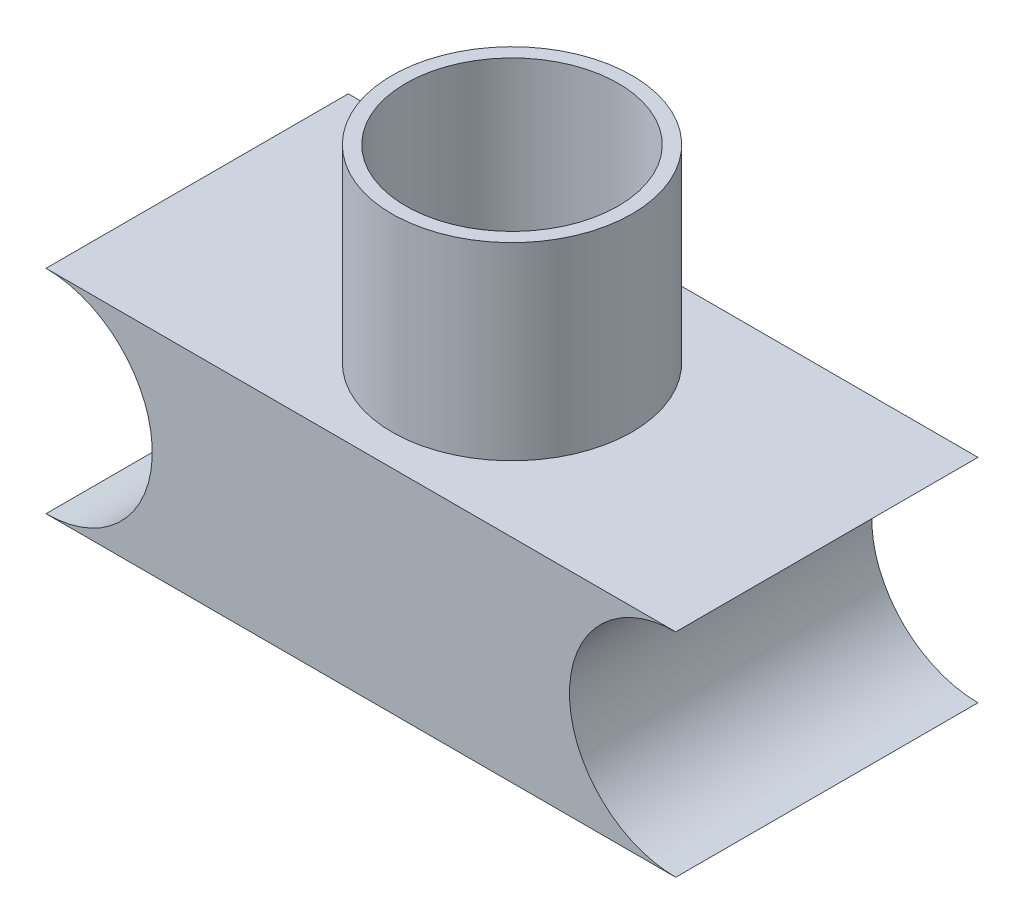
ISO-10303-21;
HEADER;
FILE_DESCRIPTION(('STEP AP214'),'2;1');
FILE_NAME('part.step','',(''),(''),'','','');
FILE_SCHEMA(('AUTOMOTIVE_DESIGN { 1 0 10303 214 1 1 1 1 }'));
ENDSEC;
DATA;
#1=APPLICATION_CONTEXT('core data for automotive mechanical design processes');
#2=APPLICATION_PROTOCOL_DEFINITION('international standard','automotive_design',2000,#1);
#3=PRODUCT_CONTEXT('',#1,'mechanical');
#4=PRODUCT('Part','Part','',(#3));
#5=PRODUCT_RELATED_PRODUCT_CATEGORY('part','',(#4));
#6=PRODUCT_DEFINITION_FORMATION('','',#4);
#7=PRODUCT_DEFINITION_CONTEXT('part definition',#1,'design');
#8=PRODUCT_DEFINITION('design','',#6,#7);
#9=PRODUCT_DEFINITION_SHAPE('','',#8);
#10=(LENGTH_UNIT() NAMED_UNIT(*) SI_UNIT(.MILLI.,.METRE.));
#11=(NAMED_UNIT(*) PLANE_ANGLE_UNIT() SI_UNIT($,.RADIAN.));
#12=(NAMED_UNIT(*) SI_UNIT($,.STERADIAN.) SOLID_ANGLE_UNIT());
#13=UNCERTAINTY_MEASURE_WITH_UNIT(LENGTH_MEASURE(1.E-05),#10,'distance_accuracy_value','');
#14=(GEOMETRIC_REPRESENTATION_CONTEXT(3) GLOBAL_UNCERTAINTY_ASSIGNED_CONTEXT((#13)) GLOBAL_UNIT_ASSIGNED_CONTEXT((#10,
#11,#12)) REPRESENTATION_CONTEXT('',''));
#15=CARTESIAN_POINT('',(0.,0.,0.));
#16=DIRECTION('',(0.,0.,1.));
#17=DIRECTION('',(1.,0.,0.));
#18=AXIS2_PLACEMENT_3D('',#15,#16,#17);
#19=CARTESIAN_POINT('',(31.75,0.,15.24));
#20=DIRECTION('',(0.,0.,-1.));
#21=DIRECTION('',(-1.,0.,0.));
#22=AXIS2_PLACEMENT_3D('',#19,#20,#21);
#23=CYLINDRICAL_SURFACE('',#22,10.715625);
#24=CARTESIAN_POINT('',(31.75,0.,-15.24));
#25=DIRECTION('',(0.,0.,-1.));
#26=DIRECTION('',(1.,0.,0.));
#27=AXIS2_PLACEMENT_3D('',#24,#25,#26);
#28=CIRCLE('',#27,10.715625);
#29=CARTESIAN_POINT('',(31.75,-10.715625,-15.24));
#30=VERTEX_POINT('',#29);
#31=CARTESIAN_POINT('',(31.75,10.715625,-15.24));
#32=VERTEX_POINT('',#31);
#33=EDGE_CURVE('E104',#30,#32,#28,.T.);
#34=ORIENTED_EDGE('',*,*,#33,.T.);
#35=DIRECTION('',(0.,0.,-1.));
#36=VECTOR('',#35,1.);
#37=CARTESIAN_POINT('',(31.75,10.715625,15.24));
#38=LINE('',#37,#36);
#39=CARTESIAN_POINT('',(31.75,10.715625,15.24));
#40=VERTEX_POINT('',#39);
#41=EDGE_CURVE('E46',#40,#32,#38,.T.);
#42=ORIENTED_EDGE('',*,*,#41,.F.);
#43=CARTESIAN_POINT('',(31.75,0.,15.24));
#44=DIRECTION('',(0.,0.,-1.));
#45=DIRECTION('',(1.,0.,0.));
#46=AXIS2_PLACEMENT_3D('',#43,#44,#45);
#47=CIRCLE('',#46,10.715625);
#48=CARTESIAN_POINT('',(31.75,-10.715625,15.24));
#49=VERTEX_POINT('',#48);
#50=EDGE_CURVE('E90',#49,#40,#47,.T.);
#51=ORIENTED_EDGE('',*,*,#50,.F.);
#52=DIRECTION('',(0.,0.,-1.));
#53=VECTOR('',#52,1.);
#54=CARTESIAN_POINT('',(31.75,-10.715625,15.24));
#55=LINE('',#54,#53);
#56=EDGE_CURVE('E100',#49,#30,#55,.T.);
#57=ORIENTED_EDGE('',*,*,#56,.T.);
#58=EDGE_LOOP('',(#34,#42,#51,#57));
#59=FACE_BOUND('',#58,.T.);
#60=ADVANCED_FACE('F38',(#59),#23,.F.);
#61=CARTESIAN_POINT('',(-31.75,10.715625,15.24));
#62=DIRECTION('',(0.,-1.,0.));
#63=DIRECTION('',(1.,0.,0.));
#64=AXIS2_PLACEMENT_3D('',#61,#62,#63);
#65=PLANE('',#64);
#66=CARTESIAN_POINT('',(0.,10.715625,0.));
#67=DIRECTION('',(0.,-1.,0.));
#68=DIRECTION('',(1.,0.,0.));
#69=AXIS2_PLACEMENT_3D('',#66,#67,#68);
#70=CIRCLE('',#69,12.099925);
#71=CARTESIAN_POINT('',(12.099925,10.715625,0.));
#72=VERTEX_POINT('',#71);
#73=EDGE_CURVE('E11',#72,#72,#70,.F.);
#74=ORIENTED_EDGE('',*,*,#73,.F.);
#75=EDGE_LOOP('',(#74));
#76=FACE_BOUND('',#75,.T.);
#77=DIRECTION('',(-1.,0.,0.));
#78=VECTOR('',#77,1.);
#79=CARTESIAN_POINT('',(-31.75,10.715625,-15.24));
#80=LINE('',#79,#78);
#81=CARTESIAN_POINT('',(-31.75,10.715625,-15.24));
#82=VERTEX_POINT('',#81);
#83=EDGE_CURVE('E95',#32,#82,#80,.T.);
#84=ORIENTED_EDGE('',*,*,#83,.T.);
#85=DIRECTION('',(0.,0.,-1.));
#86=VECTOR('',#85,1.);
#87=CARTESIAN_POINT('',(-31.75,10.715625,15.24));
#88=LINE('',#87,#86);
#89=CARTESIAN_POINT('',(-31.75,10.715625,15.24));
#90=VERTEX_POINT('',#89);
#91=EDGE_CURVE('E93',#90,#82,#88,.T.);
#92=ORIENTED_EDGE('',*,*,#91,.F.);
#93=DIRECTION('',(-1.,0.,0.));
#94=VECTOR('',#93,1.);
#95=CARTESIAN_POINT('',(-31.75,10.715625,15.24));
#96=LINE('',#95,#94);
#97=EDGE_CURVE('E85',#40,#90,#96,.T.);
#98=ORIENTED_EDGE('',*,*,#97,.F.);
#99=ORIENTED_EDGE('',*,*,#41,.T.);
#100=EDGE_LOOP('',(#84,#92,#98,#99));
#101=FACE_BOUND('',#100,.T.);
#102=ADVANCED_FACE('F94',(#76,#101),#65,.F.);
#103=CARTESIAN_POINT('',(-31.75,0.,15.24));
#104=DIRECTION('',(0.,0.,-1.));
#105=DIRECTION('',(-1.,0.,0.));
#106=AXIS2_PLACEMENT_3D('',#103,#104,#105);
#107=CYLINDRICAL_SURFACE('',#106,10.715625);
#108=CARTESIAN_POINT('',(-31.75,0.,-15.24));
#109=DIRECTION('',(0.,0.,-1.));
#110=DIRECTION('',(1.,0.,0.));
#111=AXIS2_PLACEMENT_3D('',#108,#109,#110);
#112=CIRCLE('',#111,10.715625);
#113=CARTESIAN_POINT('',(-31.75,-10.715625,-15.24));
#114=VERTEX_POINT('',#113);
#115=EDGE_CURVE('E71',#82,#114,#112,.T.);
#116=ORIENTED_EDGE('',*,*,#115,.T.);
#117=DIRECTION('',(0.,0.,-1.));
#118=VECTOR('',#117,1.);
#119=CARTESIAN_POINT('',(-31.75,-10.715625,15.24));
#120=LINE('',#119,#118);
#121=CARTESIAN_POINT('',(-31.75,-10.715625,15.24));
#122=VERTEX_POINT('',#121);
#123=EDGE_CURVE('E96',#122,#114,#120,.T.);
#124=ORIENTED_EDGE('',*,*,#123,.F.);
#125=CARTESIAN_POINT('',(-31.75,0.,15.24));
#126=DIRECTION('',(0.,0.,-1.));
#127=DIRECTION('',(1.,0.,0.));
#128=AXIS2_PLACEMENT_3D('',#125,#126,#127);
#129=CIRCLE('',#128,10.715625);
#130=EDGE_CURVE('E88',#90,#122,#129,.T.);
#131=ORIENTED_EDGE('',*,*,#130,.F.);
#132=ORIENTED_EDGE('',*,*,#91,.T.);
#133=EDGE_LOOP('',(#116,#124,#131,#132));
#134=FACE_BOUND('',#133,.T.);
#135=ADVANCED_FACE('F98',(#134),#107,.F.);
#136=CARTESIAN_POINT('',(31.75,-10.715625,15.24));
#137=DIRECTION('',(0.,1.,0.));
#138=DIRECTION('',(0.,0.,1.));
#139=AXIS2_PLACEMENT_3D('',#136,#137,#138);
#140=PLANE('',#139);
#141=DIRECTION('',(1.,0.,0.));
#142=VECTOR('',#141,1.);
#143=CARTESIAN_POINT('',(31.75,-10.715625,-15.24));
#144=LINE('',#143,#142);
#145=EDGE_CURVE('E77',#114,#30,#144,.T.);
#146=ORIENTED_EDGE('',*,*,#145,.T.);
#147=ORIENTED_EDGE('',*,*,#56,.F.);
#148=DIRECTION('',(1.,0.,0.));
#149=VECTOR('',#148,1.);
#150=CARTESIAN_POINT('',(31.75,-10.715625,15.24));
#151=LINE('',#150,#149);
#152=EDGE_CURVE('E54',#122,#49,#151,.T.);
#153=ORIENTED_EDGE('',*,*,#152,.F.);
#154=ORIENTED_EDGE('',*,*,#123,.T.);
#155=EDGE_LOOP('',(#146,#147,#153,#154));
#156=FACE_BOUND('',#155,.T.);
#157=ADVANCED_FACE('F126',(#156),#140,.F.);
#158=CARTESIAN_POINT('',(31.75,0.,15.24));
#159=DIRECTION('',(0.,0.,1.));
#160=DIRECTION('',(1.,0.,0.));
#161=AXIS2_PLACEMENT_3D('',#158,#159,#160);
#162=PLANE('',#161);
#163=ORIENTED_EDGE('',*,*,#50,.T.);
#164=ORIENTED_EDGE('',*,*,#97,.T.);
#165=ORIENTED_EDGE('',*,*,#130,.T.);
#166=ORIENTED_EDGE('',*,*,#152,.T.);
#167=EDGE_LOOP('',(#163,#164,#165,#166));
#168=FACE_BOUND('',#167,.T.);
#169=ADVANCED_FACE('F86',(#168),#162,.T.);
#170=CARTESIAN_POINT('',(31.75,0.,-15.24));
#171=DIRECTION('',(0.,0.,1.));
#172=DIRECTION('',(1.,0.,0.));
#173=AXIS2_PLACEMENT_3D('',#170,#171,#172);
#174=PLANE('',#173);
#175=ORIENTED_EDGE('',*,*,#33,.F.);
#176=ORIENTED_EDGE('',*,*,#145,.F.);
#177=ORIENTED_EDGE('',*,*,#115,.F.);
#178=ORIENTED_EDGE('',*,*,#83,.F.);
#179=EDGE_LOOP('',(#175,#176,#177,#178));
#180=FACE_BOUND('',#179,.T.);
#181=ADVANCED_FACE('F115',(#180),#174,.F.);
#182=CARTESIAN_POINT('',(0.,29.765625,0.));
#183=DIRECTION('',(0.,-1.,0.));
#184=DIRECTION('',(1.,0.,0.));
#185=AXIS2_PLACEMENT_3D('',#182,#183,#184);
#186=CYLINDRICAL_SURFACE('',#185,10.715625);
#187=CARTESIAN_POINT('',(0.,29.765625,0.));
#188=DIRECTION('',(0.,1.,0.));
#189=DIRECTION('',(-1.,0.,0.));
#190=AXIS2_PLACEMENT_3D('',#187,#188,#189);
#191=CIRCLE('',#190,10.715625);
#192=CARTESIAN_POINT('',(10.715625,29.765625,0.));
#193=VERTEX_POINT('',#192);
#194=EDGE_CURVE('E152',#193,#193,#191,.T.);
#195=CARTESIAN_POINT('',(0.,10.715625,0.));
#196=DIRECTION('',(0.,1.,0.));
#197=DIRECTION('',(-1.,0.,0.));
#198=AXIS2_PLACEMENT_3D('',#195,#196,#197);
#199=CIRCLE('',#198,10.715625);
#200=CARTESIAN_POINT('',(10.715625,10.715625,0.));
#201=VERTEX_POINT('',#200);
#202=EDGE_CURVE('E150',#201,#201,#199,.T.);
#203=CARTESIAN_POINT('',(10.715625,29.765625,0.));
#204=CARTESIAN_POINT('',(10.715625,29.5671875,0.));
#205=CARTESIAN_POINT('',(10.715625,29.36875,0.));
#206=CARTESIAN_POINT('',(10.715625,28.971875,0.));
#207=CARTESIAN_POINT('',(10.715625,28.7734375,0.));
#208=CARTESIAN_POINT('',(10.715625,28.3765625,0.));
#209=CARTESIAN_POINT('',(10.715625,28.178125,0.));
#210=CARTESIAN_POINT('',(10.715625,27.78125,0.));
#211=CARTESIAN_POINT('',(10.715625,27.5828125,0.));
#212=CARTESIAN_POINT('',(10.715625,27.1859375,0.));
#213=CARTESIAN_POINT('',(10.715625,26.9875,0.));
#214=CARTESIAN_POINT('',(10.715625,26.590625,0.));
#215=CARTESIAN_POINT('',(10.715625,26.3921875,0.));
#216=CARTESIAN_POINT('',(10.715625,25.9953125,0.));
#217=CARTESIAN_POINT('',(10.715625,25.796875,0.));
#218=CARTESIAN_POINT('',(10.715625,25.4,0.));
#219=CARTESIAN_POINT('',(10.715625,25.2015625,0.));
#220=CARTESIAN_POINT('',(10.715625,24.8046875,0.));
#221=CARTESIAN_POINT('',(10.715625,24.60625,0.));
#222=CARTESIAN_POINT('',(10.715625,24.209375,0.));
#223=CARTESIAN_POINT('',(10.715625,24.0109375,0.));
#224=CARTESIAN_POINT('',(10.715625,23.6140625,0.));
#225=CARTESIAN_POINT('',(10.715625,23.415625,0.));
#226=CARTESIAN_POINT('',(10.715625,23.01875,0.));
#227=CARTESIAN_POINT('',(10.715625,22.8203125,0.));
#228=CARTESIAN_POINT('',(10.715625,22.4234375,0.));
#229=CARTESIAN_POINT('',(10.715625,22.225,0.));
#230=CARTESIAN_POINT('',(10.715625,21.828125,0.));
#231=CARTESIAN_POINT('',(10.715625,21.6296875,0.));
#232=CARTESIAN_POINT('',(10.715625,21.2328125,0.));
#233=CARTESIAN_POINT('',(10.715625,21.034375,0.));
#234=CARTESIAN_POINT('',(10.715625,20.6375,0.));
#235=CARTESIAN_POINT('',(10.715625,20.4390625,0.));
#236=CARTESIAN_POINT('',(10.715625,20.0421875,0.));
#237=CARTESIAN_POINT('',(10.715625,19.84375,0.));
#238=CARTESIAN_POINT('',(10.715625,19.446875,0.));
#239=CARTESIAN_POINT('',(10.715625,19.2484375,0.));
#240=CARTESIAN_POINT('',(10.715625,18.8515625,0.));
#241=CARTESIAN_POINT('',(10.715625,18.653125,0.));
#242=CARTESIAN_POINT('',(10.715625,18.25625,0.));
#243=CARTESIAN_POINT('',(10.715625,18.0578125,0.));
#244=CARTESIAN_POINT('',(10.715625,17.6609375,0.));
#245=CARTESIAN_POINT('',(10.715625,17.4625,0.));
#246=CARTESIAN_POINT('',(10.715625,17.065625,0.));
#247=CARTESIAN_POINT('',(10.715625,16.8671875,0.));
#248=CARTESIAN_POINT('',(10.715625,16.4703125,0.));
#249=CARTESIAN_POINT('',(10.715625,16.271875,0.));
#250=CARTESIAN_POINT('',(10.715625,15.875,0.));
#251=CARTESIAN_POINT('',(10.715625,15.6765625,0.));
#252=CARTESIAN_POINT('',(10.715625,15.2796875,0.));
#253=CARTESIAN_POINT('',(10.715625,15.08125,0.));
#254=CARTESIAN_POINT('',(10.715625,14.684375,0.));
#255=CARTESIAN_POINT('',(10.715625,14.4859375,0.));
#256=CARTESIAN_POINT('',(10.715625,14.0890625,0.));
#257=CARTESIAN_POINT('',(10.715625,13.890625,0.));
#258=CARTESIAN_POINT('',(10.715625,13.49375,0.));
#259=CARTESIAN_POINT('',(10.715625,13.2953125,0.));
#260=CARTESIAN_POINT('',(10.715625,12.8984375,0.));
#261=CARTESIAN_POINT('',(10.715625,12.7,0.));
#262=CARTESIAN_POINT('',(10.715625,12.303125,0.));
#263=CARTESIAN_POINT('',(10.715625,12.1046875,0.));
#264=CARTESIAN_POINT('',(10.715625,11.7078125,0.));
#265=CARTESIAN_POINT('',(10.715625,11.509375,0.));
#266=CARTESIAN_POINT('',(10.715625,11.1125,0.));
#267=CARTESIAN_POINT('',(10.715625,10.9140625,0.));
#268=CARTESIAN_POINT('',(10.715625,10.715625,0.));
#269=B_SPLINE_CURVE_WITH_KNOTS('',3,(#203,#204,#205,#206,#207,#208,#209,#210,#211,#212,#213,
#214,#215,#216,#217,#218,#219,#220,#221,#222,#223,#224,#225,#226,#227,#228,#229,#230,#231,#232,
#233,#234,#235,#236,#237,#238,#239,#240,#241,#242,#243,#244,#245,#246,#247,#248,#249,#250,#251,
#252,#253,#254,#255,#256,#257,#258,#259,#260,#261,#262,#263,#264,#265,#266,#267,#268),
.UNSPECIFIED.,.F.,.F.,(4,2,2,2,2,2,2,2,2,2,2,2,2,2,2,2,2,2,2,2,2,2,2,2,2,2,2,2,2,2,2,2,4),(0.,
0.595312499999997,1.190625,1.7859375,2.38125,2.9765625,3.571875,4.1671875,4.7625,5.3578125,
5.953125,6.5484375,7.14375,7.7390625,8.334375,8.9296875,9.525,10.1203125,10.715625,11.3109375,
11.90625,12.5015625,13.096875,13.6921875,14.2875,14.8828125,15.478125,16.0734375,16.66875,
17.2640625,17.859375,18.4546875,19.05),.UNSPECIFIED.);
#270=EDGE_CURVE('BSEAM117',#193,#201,#269,.T.);
#271=ORIENTED_EDGE('',*,*,#194,.T.);
#272=ORIENTED_EDGE('',*,*,#202,.F.);
#273=ORIENTED_EDGE('',*,*,#270,.T.);
#274=ORIENTED_EDGE('',*,*,#270,.F.);
#275=EDGE_LOOP('',(#271,#273,#272,#274));
#276=FACE_BOUND('',#275,.T.);
#277=ADVANCED_FACE('F117',(#276),#186,.F.);
#278=CARTESIAN_POINT('',(0.,29.765625,0.));
#279=DIRECTION('',(0.,-1.,0.));
#280=DIRECTION('',(1.,0.,0.));
#281=AXIS2_PLACEMENT_3D('',#278,#279,#280);
#282=CYLINDRICAL_SURFACE('',#281,12.099925);
#283=CARTESIAN_POINT('',(0.,29.765625,0.));
#284=DIRECTION('',(0.,1.,0.));
#285=DIRECTION('',(-1.,0.,0.));
#286=AXIS2_PLACEMENT_3D('',#283,#284,#285);
#287=CIRCLE('',#286,12.099925);
#288=CARTESIAN_POINT('',(12.099925,29.765625,0.));
#289=VERTEX_POINT('',#288);
#290=EDGE_CURVE('E107',#289,#289,#287,.T.);
#291=CARTESIAN_POINT('',(12.099925,29.765625,0.));
#292=CARTESIAN_POINT('',(12.099925,29.5671875,0.));
#293=CARTESIAN_POINT('',(12.099925,29.36875,0.));
#294=CARTESIAN_POINT('',(12.099925,28.971875,0.));
#295=CARTESIAN_POINT('',(12.099925,28.7734375,0.));
#296=CARTESIAN_POINT('',(12.099925,28.3765625,0.));
#297=CARTESIAN_POINT('',(12.099925,28.178125,0.));
#298=CARTESIAN_POINT('',(12.099925,27.78125,0.));
#299=CARTESIAN_POINT('',(12.099925,27.5828125,0.));
#300=CARTESIAN_POINT('',(12.099925,27.1859375,0.));
#301=CARTESIAN_POINT('',(12.099925,26.9875,0.));
#302=CARTESIAN_POINT('',(12.099925,26.590625,0.));
#303=CARTESIAN_POINT('',(12.099925,26.3921875,0.));
#304=CARTESIAN_POINT('',(12.099925,25.9953125,0.));
#305=CARTESIAN_POINT('',(12.099925,25.796875,0.));
#306=CARTESIAN_POINT('',(12.099925,25.4,0.));
#307=CARTESIAN_POINT('',(12.099925,25.2015625,0.));
#308=CARTESIAN_POINT('',(12.099925,24.8046875,0.));
#309=CARTESIAN_POINT('',(12.099925,24.60625,0.));
#310=CARTESIAN_POINT('',(12.099925,24.209375,0.));
#311=CARTESIAN_POINT('',(12.099925,24.0109375,0.));
#312=CARTESIAN_POINT('',(12.099925,23.6140625,0.));
#313=CARTESIAN_POINT('',(12.099925,23.415625,0.));
#314=CARTESIAN_POINT('',(12.099925,23.01875,0.));
#315=CARTESIAN_POINT('',(12.099925,22.8203125,0.));
#316=CARTESIAN_POINT('',(12.099925,22.4234375,0.));
#317=CARTESIAN_POINT('',(12.099925,22.225,0.));
#318=CARTESIAN_POINT('',(12.099925,21.828125,0.));
#319=CARTESIAN_POINT('',(12.099925,21.6296875,0.));
#320=CARTESIAN_POINT('',(12.099925,21.2328125,0.));
#321=CARTESIAN_POINT('',(12.099925,21.034375,0.));
#322=CARTESIAN_POINT('',(12.099925,20.6375,0.));
#323=CARTESIAN_POINT('',(12.099925,20.4390625,0.));
#324=CARTESIAN_POINT('',(12.099925,20.0421875,0.));
#325=CARTESIAN_POINT('',(12.099925,19.84375,0.));
#326=CARTESIAN_POINT('',(12.099925,19.446875,0.));
#327=CARTESIAN_POINT('',(12.099925,19.2484375,0.));
#328=CARTESIAN_POINT('',(12.099925,18.8515625,0.));
#329=CARTESIAN_POINT('',(12.099925,18.653125,0.));
#330=CARTESIAN_POINT('',(12.099925,18.25625,0.));
#331=CARTESIAN_POINT('',(12.099925,18.0578125,0.));
#332=CARTESIAN_POINT('',(12.099925,17.6609375,0.));
#333=CARTESIAN_POINT('',(12.099925,17.4625,0.));
#334=CARTESIAN_POINT('',(12.099925,17.065625,0.));
#335=CARTESIAN_POINT('',(12.099925,16.8671875,0.));
#336=CARTESIAN_POINT('',(12.099925,16.4703125,0.));
#337=CARTESIAN_POINT('',(12.099925,16.271875,0.));
#338=CARTESIAN_POINT('',(12.099925,15.875,0.));
#339=CARTESIAN_POINT('',(12.099925,15.6765625,0.));
#340=CARTESIAN_POINT('',(12.099925,15.2796875,0.));
#341=CARTESIAN_POINT('',(12.099925,15.08125,0.));
#342=CARTESIAN_POINT('',(12.099925,14.684375,0.));
#343=CARTESIAN_POINT('',(12.099925,14.4859375,0.));
#344=CARTESIAN_POINT('',(12.099925,14.0890625,0.));
#345=CARTESIAN_POINT('',(12.099925,13.890625,0.));
#346=CARTESIAN_POINT('',(12.099925,13.49375,0.));
#347=CARTESIAN_POINT('',(12.099925,13.2953125,0.));
#348=CARTESIAN_POINT('',(12.099925,12.8984375,0.));
#349=CARTESIAN_POINT('',(12.099925,12.7,0.));
#350=CARTESIAN_POINT('',(12.099925,12.303125,0.));
#351=CARTESIAN_POINT('',(12.099925,12.1046875,0.));
#352=CARTESIAN_POINT('',(12.099925,11.7078125,0.));
#353=CARTESIAN_POINT('',(12.099925,11.509375,0.));
#354=CARTESIAN_POINT('',(12.099925,11.1125,0.));
#355=CARTESIAN_POINT('',(12.099925,10.9140625,0.));
#356=CARTESIAN_POINT('',(12.099925,10.715625,0.));
#357=B_SPLINE_CURVE_WITH_KNOTS('',3,(#291,#292,#293,#294,#295,#296,#297,#298,#299,#300,#301,
#302,#303,#304,#305,#306,#307,#308,#309,#310,#311,#312,#313,#314,#315,#316,#317,#318,#319,#320,
#321,#322,#323,#324,#325,#326,#327,#328,#329,#330,#331,#332,#333,#334,#335,#336,#337,#338,#339,
#340,#341,#342,#343,#344,#345,#346,#347,#348,#349,#350,#351,#352,#353,#354,#355,#356),
.UNSPECIFIED.,.F.,.F.,(4,2,2,2,2,2,2,2,2,2,2,2,2,2,2,2,2,2,2,2,2,2,2,2,2,2,2,2,2,2,2,2,4),(0.,
0.5953125,1.190625,1.7859375,2.38125,2.9765625,3.571875,4.1671875,4.7625,5.3578125,5.953125,
6.5484375,7.14375,7.7390625,8.334375,8.9296875,9.525,10.1203125,10.715625,11.3109375,11.90625,
12.5015625,13.096875,13.6921875,14.2875,14.8828125,15.478125,16.0734375,16.66875,17.2640625,
17.859375,18.4546875,19.05),.UNSPECIFIED.);
#358=EDGE_CURVE('BSEAM123',#289,#72,#357,.T.);
#359=ORIENTED_EDGE('',*,*,#290,.F.);
#360=ORIENTED_EDGE('',*,*,#73,.T.);
#361=ORIENTED_EDGE('',*,*,#358,.T.);
#362=ORIENTED_EDGE('',*,*,#358,.F.);
#363=EDGE_LOOP('',(#359,#361,#360,#362));
#364=FACE_BOUND('',#363,.T.);
#365=ADVANCED_FACE('F123',(#364),#282,.T.);
#366=CARTESIAN_POINT('',(0.,29.765625,0.));
#367=DIRECTION('',(0.,1.,0.));
#368=DIRECTION('',(-1.,0.,0.));
#369=AXIS2_PLACEMENT_3D('',#366,#367,#368);
#370=PLANE('',#369);
#371=ORIENTED_EDGE('',*,*,#194,.F.);
#372=EDGE_LOOP('',(#371));
#373=FACE_BOUND('',#372,.T.);
#374=ORIENTED_EDGE('',*,*,#290,.T.);
#375=EDGE_LOOP('',(#374));
#376=FACE_BOUND('',#375,.T.);
#377=ADVANCED_FACE('F141',(#373,#376),#370,.T.);
#378=ORIENTED_EDGE('',*,*,#202,.T.);
#379=EDGE_LOOP('',(#378));
#380=FACE_BOUND('',#379,.T.);
#381=ADVANCED_FACE('F134',(#380),#65,.F.);
#382=CLOSED_SHELL('',(#60,#102,#135,#157,#169,#181,#277,#365,#377,#381));
#383=MANIFOLD_SOLID_BREP('B2',#382);
#384=ADVANCED_BREP_SHAPE_REPRESENTATION('',(#18,#383),#14);
#385=SHAPE_DEFINITION_REPRESENTATION(#9,#384);
ENDSEC;
END-ISO-10303-21;
